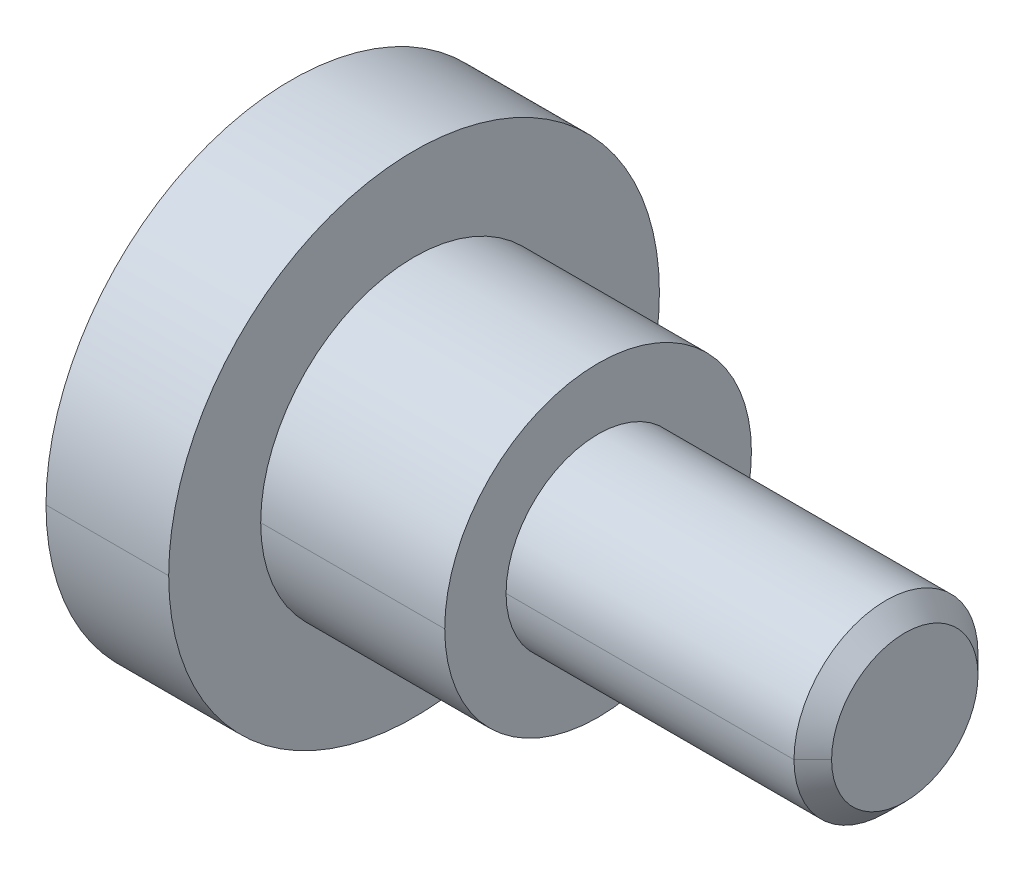
ISO-10303-21;
HEADER;
FILE_DESCRIPTION(('STEP AP214'),'2;1');
FILE_NAME('part.step','',(''),(''),'','','');
FILE_SCHEMA(('AUTOMOTIVE_DESIGN { 1 0 10303 214 1 1 1 1 }'));
ENDSEC;
DATA;
#1=APPLICATION_CONTEXT('core data for automotive mechanical design processes');
#2=APPLICATION_PROTOCOL_DEFINITION('international standard','automotive_design',2000,#1);
#3=PRODUCT_CONTEXT('',#1,'mechanical');
#4=PRODUCT('Part','Part','',(#3));
#5=PRODUCT_RELATED_PRODUCT_CATEGORY('part','',(#4));
#6=PRODUCT_DEFINITION_FORMATION('','',#4);
#7=PRODUCT_DEFINITION_CONTEXT('part definition',#1,'design');
#8=PRODUCT_DEFINITION('design','',#6,#7);
#9=PRODUCT_DEFINITION_SHAPE('','',#8);
#10=(LENGTH_UNIT() NAMED_UNIT(*) SI_UNIT(.MILLI.,.METRE.));
#11=(NAMED_UNIT(*) PLANE_ANGLE_UNIT() SI_UNIT($,.RADIAN.));
#12=(NAMED_UNIT(*) SI_UNIT($,.STERADIAN.) SOLID_ANGLE_UNIT());
#13=UNCERTAINTY_MEASURE_WITH_UNIT(LENGTH_MEASURE(1.E-05),#10,'distance_accuracy_value','');
#14=(GEOMETRIC_REPRESENTATION_CONTEXT(3) GLOBAL_UNCERTAINTY_ASSIGNED_CONTEXT((#13)) GLOBAL_UNIT_ASSIGNED_CONTEXT((#10,
#11,#12)) REPRESENTATION_CONTEXT('',''));
#15=CARTESIAN_POINT('',(0.,0.,0.));
#16=DIRECTION('',(0.,0.,1.));
#17=DIRECTION('',(1.,0.,0.));
#18=AXIS2_PLACEMENT_3D('',#15,#16,#17);
#19=CARTESIAN_POINT('',(-3.,0.,0.));
#20=DIRECTION('',(-1.,0.,0.));
#21=DIRECTION('',(0.,0.,1.));
#22=AXIS2_PLACEMENT_3D('',#19,#20,#21);
#23=PLANE('',#22);
#24=DIRECTION('',(0.,0.500000000000029,0.866025403784422));
#25=VECTOR('',#24,1.);
#26=CARTESIAN_POINT('',(-3.,-1.1547005383793,0.));
#27=LINE('',#26,#25);
#28=CARTESIAN_POINT('',(-3.,-1.1547005383793,0.));
#29=VERTEX_POINT('',#28);
#30=CARTESIAN_POINT('',(-3.,-0.866025403784422,0.500000000000029));
#31=VERTEX_POINT('',#30);
#32=EDGE_CURVE('E11',#29,#31,#27,.T.);
#33=ORIENTED_EDGE('',*,*,#32,.T.);
#34=CARTESIAN_POINT('',(-3.,0.,0.));
#35=DIRECTION('',(1.,0.,0.));
#36=DIRECTION('',(0.,0.,1.));
#37=AXIS2_PLACEMENT_3D('',#34,#35,#36);
#38=CIRCLE('',#37,1.);
#39=CARTESIAN_POINT('',(-3.,-0.866025403784422,-0.500000000000029));
#40=VERTEX_POINT('',#39);
#41=EDGE_CURVE('E24',#31,#40,#38,.T.);
#42=ORIENTED_EDGE('',*,*,#41,.T.);
#43=DIRECTION('',(0.,-0.500000000000029,0.866025403784422));
#44=VECTOR('',#43,1.);
#45=CARTESIAN_POINT('',(-3.,-0.57735026918963,-1.));
#46=LINE('',#45,#44);
#47=EDGE_CURVE('E377',#40,#29,#46,.T.);
#48=ORIENTED_EDGE('',*,*,#47,.T.);
#49=EDGE_LOOP('',(#33,#42,#48));
#50=FACE_BOUND('',#49,.T.);
#51=ADVANCED_FACE('F16',(#50),#23,.T.);
#52=CARTESIAN_POINT('',(-3.,-0.57735026918963,-1.));
#53=DIRECTION('',(0.,-0.866025403784422,-0.500000000000029));
#54=DIRECTION('',(0.,0.500000000000029,-0.866025403784422));
#55=AXIS2_PLACEMENT_3D('',#52,#53,#54);
#56=PLANE('',#55);
#57=DIRECTION('',(0.,-0.500000000000029,0.866025403784422));
#58=VECTOR('',#57,1.);
#59=CARTESIAN_POINT('',(-5.,-0.57735026918963,-1.));
#60=LINE('',#59,#58);
#61=CARTESIAN_POINT('',(-5.,-0.57735026918963,-1.));
#62=VERTEX_POINT('',#61);
#63=CARTESIAN_POINT('',(-5.,-1.1547005383793,0.));
#64=VERTEX_POINT('',#63);
#65=EDGE_CURVE('E373',#62,#64,#60,.T.);
#66=ORIENTED_EDGE('',*,*,#65,.T.);
#67=DIRECTION('',(-1.,0.,0.));
#68=VECTOR('',#67,1.);
#69=CARTESIAN_POINT('',(-3.,-1.1547005383793,0.));
#70=LINE('',#69,#68);
#71=EDGE_CURVE('E368',#29,#64,#70,.T.);
#72=ORIENTED_EDGE('',*,*,#71,.F.);
#73=ORIENTED_EDGE('',*,*,#47,.F.);
#74=DIRECTION('',(0.,-0.500000000000029,0.866025403784422));
#75=VECTOR('',#74,1.);
#76=CARTESIAN_POINT('',(-3.,-0.57735026918963,-1.));
#77=LINE('',#76,#75);
#78=CARTESIAN_POINT('',(-3.,-0.57735026918963,-1.));
#79=VERTEX_POINT('',#78);
#80=EDGE_CURVE('E363',#79,#40,#77,.T.);
#81=ORIENTED_EDGE('',*,*,#80,.F.);
#82=DIRECTION('',(-1.,0.,0.));
#83=VECTOR('',#82,1.);
#84=CARTESIAN_POINT('',(-3.,-0.57735026918963,-1.));
#85=LINE('',#84,#83);
#86=EDGE_CURVE('E359',#79,#62,#85,.T.);
#87=ORIENTED_EDGE('',*,*,#86,.T.);
#88=EDGE_LOOP('',(#66,#72,#73,#81,#87));
#89=FACE_BOUND('',#88,.T.);
#90=ADVANCED_FACE('F388',(#89),#56,.F.);
#91=CARTESIAN_POINT('',(-3.,0.57735026918963,-1.));
#92=DIRECTION('',(0.,0.,-1.));
#93=DIRECTION('',(-1.,0.,0.));
#94=AXIS2_PLACEMENT_3D('',#91,#92,#93);
#95=PLANE('',#94);
#96=DIRECTION('',(0.,-1.,0.));
#97=VECTOR('',#96,1.);
#98=CARTESIAN_POINT('',(-5.,0.57735026918963,-1.));
#99=LINE('',#98,#97);
#100=CARTESIAN_POINT('',(-5.,0.57735026918963,-1.));
#101=VERTEX_POINT('',#100);
#102=EDGE_CURVE('E354',#101,#62,#99,.T.);
#103=ORIENTED_EDGE('',*,*,#102,.T.);
#104=ORIENTED_EDGE('',*,*,#86,.F.);
#105=DIRECTION('',(0.,-1.,0.));
#106=VECTOR('',#105,1.);
#107=CARTESIAN_POINT('',(-3.,0.57735026918963,-1.));
#108=LINE('',#107,#106);
#109=CARTESIAN_POINT('',(-3.,0.,-1.));
#110=VERTEX_POINT('',#109);
#111=EDGE_CURVE('E349',#110,#79,#108,.T.);
#112=ORIENTED_EDGE('',*,*,#111,.F.);
#113=DIRECTION('',(0.,-1.,0.));
#114=VECTOR('',#113,1.);
#115=CARTESIAN_POINT('',(-3.,0.57735026918963,-1.));
#116=LINE('',#115,#114);
#117=CARTESIAN_POINT('',(-3.,0.57735026918963,-1.));
#118=VERTEX_POINT('',#117);
#119=EDGE_CURVE('E344',#118,#110,#116,.T.);
#120=ORIENTED_EDGE('',*,*,#119,.F.);
#121=DIRECTION('',(-1.,0.,0.));
#122=VECTOR('',#121,1.);
#123=CARTESIAN_POINT('',(-3.,0.57735026918963,-1.));
#124=LINE('',#123,#122);
#125=EDGE_CURVE('E340',#118,#101,#124,.T.);
#126=ORIENTED_EDGE('',*,*,#125,.T.);
#127=EDGE_LOOP('',(#103,#104,#112,#120,#126));
#128=FACE_BOUND('',#127,.T.);
#129=ADVANCED_FACE('F406',(#128),#95,.F.);
#130=CARTESIAN_POINT('',(-3.,1.1547005383793,0.));
#131=DIRECTION('',(0.,0.866025403784422,-0.500000000000029));
#132=DIRECTION('',(0.,0.500000000000029,0.866025403784422));
#133=AXIS2_PLACEMENT_3D('',#130,#131,#132);
#134=PLANE('',#133);
#135=DIRECTION('',(0.,-0.500000000000029,-0.866025403784422));
#136=VECTOR('',#135,1.);
#137=CARTESIAN_POINT('',(-5.,1.1547005383793,0.));
#138=LINE('',#137,#136);
#139=CARTESIAN_POINT('',(-5.,1.1547005383793,0.));
#140=VERTEX_POINT('',#139);
#141=EDGE_CURVE('E335',#140,#101,#138,.T.);
#142=ORIENTED_EDGE('',*,*,#141,.T.);
#143=ORIENTED_EDGE('',*,*,#125,.F.);
#144=DIRECTION('',(0.,-0.500000000000029,-0.866025403784422));
#145=VECTOR('',#144,1.);
#146=CARTESIAN_POINT('',(-3.,1.1547005383793,0.));
#147=LINE('',#146,#145);
#148=CARTESIAN_POINT('',(-3.,0.866025403784422,-0.500000000000029));
#149=VERTEX_POINT('',#148);
#150=EDGE_CURVE('E330',#149,#118,#147,.T.);
#151=ORIENTED_EDGE('',*,*,#150,.F.);
#152=DIRECTION('',(0.,-0.500000000000029,-0.866025403784422));
#153=VECTOR('',#152,1.);
#154=CARTESIAN_POINT('',(-3.,1.1547005383793,0.));
#155=LINE('',#154,#153);
#156=CARTESIAN_POINT('',(-3.,1.1547005383793,0.));
#157=VERTEX_POINT('',#156);
#158=EDGE_CURVE('E325',#157,#149,#155,.T.);
#159=ORIENTED_EDGE('',*,*,#158,.F.);
#160=DIRECTION('',(-1.,0.,0.));
#161=VECTOR('',#160,1.);
#162=CARTESIAN_POINT('',(-3.,1.1547005383793,0.));
#163=LINE('',#162,#161);
#164=EDGE_CURVE('E321',#157,#140,#163,.T.);
#165=ORIENTED_EDGE('',*,*,#164,.T.);
#166=EDGE_LOOP('',(#142,#143,#151,#159,#165));
#167=FACE_BOUND('',#166,.T.);
#168=ADVANCED_FACE('F429',(#167),#134,.F.);
#169=CARTESIAN_POINT('',(-3.,0.57735026918963,1.));
#170=DIRECTION('',(0.,0.866025403784422,0.500000000000029));
#171=DIRECTION('',(0.,-0.500000000000029,0.866025403784422));
#172=AXIS2_PLACEMENT_3D('',#169,#170,#171);
#173=PLANE('',#172);
#174=DIRECTION('',(0.,0.500000000000029,-0.866025403784422));
#175=VECTOR('',#174,1.);
#176=CARTESIAN_POINT('',(-5.,0.57735026918963,1.));
#177=LINE('',#176,#175);
#178=CARTESIAN_POINT('',(-5.,0.57735026918963,1.));
#179=VERTEX_POINT('',#178);
#180=EDGE_CURVE('E316',#179,#140,#177,.T.);
#181=ORIENTED_EDGE('',*,*,#180,.T.);
#182=ORIENTED_EDGE('',*,*,#164,.F.);
#183=DIRECTION('',(0.,0.500000000000029,-0.866025403784422));
#184=VECTOR('',#183,1.);
#185=CARTESIAN_POINT('',(-3.,0.57735026918963,1.));
#186=LINE('',#185,#184);
#187=CARTESIAN_POINT('',(-3.,0.866025403784422,0.500000000000029));
#188=VERTEX_POINT('',#187);
#189=EDGE_CURVE('E311',#188,#157,#186,.T.);
#190=ORIENTED_EDGE('',*,*,#189,.F.);
#191=DIRECTION('',(0.,0.500000000000029,-0.866025403784422));
#192=VECTOR('',#191,1.);
#193=CARTESIAN_POINT('',(-3.,0.57735026918963,1.));
#194=LINE('',#193,#192);
#195=CARTESIAN_POINT('',(-3.,0.57735026918963,1.));
#196=VERTEX_POINT('',#195);
#197=EDGE_CURVE('E306',#196,#188,#194,.T.);
#198=ORIENTED_EDGE('',*,*,#197,.F.);
#199=DIRECTION('',(-1.,0.,0.));
#200=VECTOR('',#199,1.);
#201=CARTESIAN_POINT('',(-3.,0.57735026918963,1.));
#202=LINE('',#201,#200);
#203=EDGE_CURVE('E302',#196,#179,#202,.T.);
#204=ORIENTED_EDGE('',*,*,#203,.T.);
#205=EDGE_LOOP('',(#181,#182,#190,#198,#204));
#206=FACE_BOUND('',#205,.T.);
#207=ADVANCED_FACE('F431',(#206),#173,.F.);
#208=CARTESIAN_POINT('',(-3.,-0.57735026918963,1.));
#209=DIRECTION('',(0.,0.,1.));
#210=DIRECTION('',(1.,0.,0.));
#211=AXIS2_PLACEMENT_3D('',#208,#209,#210);
#212=PLANE('',#211);
#213=DIRECTION('',(0.,1.,0.));
#214=VECTOR('',#213,1.);
#215=CARTESIAN_POINT('',(-5.,-0.57735026918963,1.));
#216=LINE('',#215,#214);
#217=CARTESIAN_POINT('',(-5.,-0.57735026918963,1.));
#218=VERTEX_POINT('',#217);
#219=EDGE_CURVE('E297',#218,#179,#216,.T.);
#220=ORIENTED_EDGE('',*,*,#219,.T.);
#221=ORIENTED_EDGE('',*,*,#203,.F.);
#222=DIRECTION('',(0.,1.,0.));
#223=VECTOR('',#222,1.);
#224=CARTESIAN_POINT('',(-3.,-0.57735026918963,1.));
#225=LINE('',#224,#223);
#226=CARTESIAN_POINT('',(-3.,0.,1.));
#227=VERTEX_POINT('',#226);
#228=EDGE_CURVE('E292',#227,#196,#225,.T.);
#229=ORIENTED_EDGE('',*,*,#228,.F.);
#230=DIRECTION('',(0.,1.,0.));
#231=VECTOR('',#230,1.);
#232=CARTESIAN_POINT('',(-3.,-0.57735026918963,1.));
#233=LINE('',#232,#231);
#234=CARTESIAN_POINT('',(-3.,-0.57735026918963,1.));
#235=VERTEX_POINT('',#234);
#236=EDGE_CURVE('E287',#235,#227,#233,.T.);
#237=ORIENTED_EDGE('',*,*,#236,.F.);
#238=DIRECTION('',(-1.,0.,0.));
#239=VECTOR('',#238,1.);
#240=CARTESIAN_POINT('',(-3.,-0.57735026918963,1.));
#241=LINE('',#240,#239);
#242=EDGE_CURVE('E283',#235,#218,#241,.T.);
#243=ORIENTED_EDGE('',*,*,#242,.T.);
#244=EDGE_LOOP('',(#220,#221,#229,#237,#243));
#245=FACE_BOUND('',#244,.T.);
#246=ADVANCED_FACE('F415',(#245),#212,.F.);
#247=CARTESIAN_POINT('',(-3.,-1.1547005383793,0.));
#248=DIRECTION('',(0.,-0.866025403784422,0.500000000000029));
#249=DIRECTION('',(0.,-0.500000000000029,-0.866025403784422));
#250=AXIS2_PLACEMENT_3D('',#247,#248,#249);
#251=PLANE('',#250);
#252=DIRECTION('',(0.,0.500000000000029,0.866025403784422));
#253=VECTOR('',#252,1.);
#254=CARTESIAN_POINT('',(-5.,-1.1547005383793,0.));
#255=LINE('',#254,#253);
#256=EDGE_CURVE('E278',#64,#218,#255,.T.);
#257=ORIENTED_EDGE('',*,*,#256,.T.);
#258=ORIENTED_EDGE('',*,*,#242,.F.);
#259=DIRECTION('',(0.,0.500000000000029,0.866025403784422));
#260=VECTOR('',#259,1.);
#261=CARTESIAN_POINT('',(-3.,-1.1547005383793,0.));
#262=LINE('',#261,#260);
#263=EDGE_CURVE('E273',#31,#235,#262,.T.);
#264=ORIENTED_EDGE('',*,*,#263,.F.);
#265=ORIENTED_EDGE('',*,*,#32,.F.);
#266=ORIENTED_EDGE('',*,*,#71,.T.);
#267=EDGE_LOOP('',(#257,#258,#264,#265,#266));
#268=FACE_BOUND('',#267,.T.);
#269=ADVANCED_FACE('F393',(#268),#251,.F.);
#270=CARTESIAN_POINT('',(-3.,0.,0.));
#271=DIRECTION('',(-1.,0.,0.));
#272=DIRECTION('',(0.,0.,1.));
#273=AXIS2_PLACEMENT_3D('',#270,#271,#272);
#274=PLANE('',#273);
#275=ORIENTED_EDGE('',*,*,#236,.T.);
#276=CARTESIAN_POINT('',(-3.,0.,0.));
#277=DIRECTION('',(1.,0.,0.));
#278=DIRECTION('',(0.,0.,1.));
#279=AXIS2_PLACEMENT_3D('',#276,#277,#278);
#280=CIRCLE('',#279,1.);
#281=EDGE_CURVE('E268',#227,#31,#280,.T.);
#282=ORIENTED_EDGE('',*,*,#281,.T.);
#283=ORIENTED_EDGE('',*,*,#263,.T.);
#284=EDGE_LOOP('',(#275,#282,#283));
#285=FACE_BOUND('',#284,.T.);
#286=ADVANCED_FACE('F397',(#285),#274,.T.);
#287=CARTESIAN_POINT('',(-3.,0.,0.));
#288=DIRECTION('',(-1.,0.,0.));
#289=DIRECTION('',(0.,1.,0.));
#290=AXIS2_PLACEMENT_3D('',#287,#288,#289);
#291=CONICAL_SURFACE('',#290,1.,1.04719755119662);
#292=DIRECTION('',(-0.499999999999983,0.,-0.866025403784448));
#293=VECTOR('',#292,1.);
#294=CARTESIAN_POINT('',(-2.4226497308104,0.,0.));
#295=LINE('',#294,#293);
#296=CARTESIAN_POINT('',(-2.4226497308104,0.,0.));
#297=VERTEX_POINT('',#296);
#298=EDGE_CURVE('E263',#297,#110,#295,.T.);
#299=ORIENTED_EDGE('',*,*,#298,.T.);
#300=CARTESIAN_POINT('',(-3.,0.,0.));
#301=DIRECTION('',(1.,0.,0.));
#302=DIRECTION('',(0.,0.,1.));
#303=AXIS2_PLACEMENT_3D('',#300,#301,#302);
#304=CIRCLE('',#303,1.);
#305=EDGE_CURVE('E258',#40,#110,#304,.T.);
#306=ORIENTED_EDGE('',*,*,#305,.F.);
#307=ORIENTED_EDGE('',*,*,#41,.F.);
#308=ORIENTED_EDGE('',*,*,#281,.F.);
#309=DIRECTION('',(-0.499999999999983,0.,0.866025403784448));
#310=VECTOR('',#309,1.);
#311=CARTESIAN_POINT('',(-2.4226497308104,0.,0.));
#312=LINE('',#311,#310);
#313=EDGE_CURVE('E253',#297,#227,#312,.T.);
#314=ORIENTED_EDGE('',*,*,#313,.F.);
#315=EDGE_LOOP('',(#299,#306,#307,#308,#314));
#316=FACE_BOUND('',#315,.T.);
#317=ADVANCED_FACE('F399',(#316),#291,.F.);
#318=CARTESIAN_POINT('',(-3.,0.,0.));
#319=DIRECTION('',(-1.,0.,0.));
#320=DIRECTION('',(0.,-1.,0.));
#321=AXIS2_PLACEMENT_3D('',#318,#319,#320);
#322=CONICAL_SURFACE('',#321,1.,1.04719755119662);
#323=ORIENTED_EDGE('',*,*,#313,.T.);
#324=CARTESIAN_POINT('',(-3.,0.,0.));
#325=DIRECTION('',(1.,0.,0.));
#326=DIRECTION('',(0.,0.,1.));
#327=AXIS2_PLACEMENT_3D('',#324,#325,#326);
#328=CIRCLE('',#327,1.);
#329=EDGE_CURVE('E248',#188,#227,#328,.T.);
#330=ORIENTED_EDGE('',*,*,#329,.F.);
#331=CARTESIAN_POINT('',(-3.,0.,0.));
#332=DIRECTION('',(1.,0.,0.));
#333=DIRECTION('',(0.,0.,1.));
#334=AXIS2_PLACEMENT_3D('',#331,#332,#333);
#335=CIRCLE('',#334,1.);
#336=EDGE_CURVE('E243',#149,#188,#335,.T.);
#337=ORIENTED_EDGE('',*,*,#336,.F.);
#338=CARTESIAN_POINT('',(-3.,0.,0.));
#339=DIRECTION('',(1.,0.,0.));
#340=DIRECTION('',(0.,0.,1.));
#341=AXIS2_PLACEMENT_3D('',#338,#339,#340);
#342=CIRCLE('',#341,1.);
#343=EDGE_CURVE('E238',#110,#149,#342,.T.);
#344=ORIENTED_EDGE('',*,*,#343,.F.);
#345=ORIENTED_EDGE('',*,*,#298,.F.);
#346=EDGE_LOOP('',(#323,#330,#337,#344,#345));
#347=FACE_BOUND('',#346,.T.);
#348=ADVANCED_FACE('F421',(#347),#322,.F.);
#349=CARTESIAN_POINT('',(-3.,0.,0.));
#350=DIRECTION('',(-1.,0.,0.));
#351=DIRECTION('',(0.,0.,1.));
#352=AXIS2_PLACEMENT_3D('',#349,#350,#351);
#353=PLANE('',#352);
#354=ORIENTED_EDGE('',*,*,#119,.T.);
#355=ORIENTED_EDGE('',*,*,#343,.T.);
#356=ORIENTED_EDGE('',*,*,#150,.T.);
#357=EDGE_LOOP('',(#354,#355,#356));
#358=FACE_BOUND('',#357,.T.);
#359=ADVANCED_FACE('F424',(#358),#353,.T.);
#360=CARTESIAN_POINT('',(-3.,0.,0.));
#361=DIRECTION('',(-1.,0.,0.));
#362=DIRECTION('',(0.,0.,1.));
#363=AXIS2_PLACEMENT_3D('',#360,#361,#362);
#364=PLANE('',#363);
#365=ORIENTED_EDGE('',*,*,#158,.T.);
#366=ORIENTED_EDGE('',*,*,#336,.T.);
#367=ORIENTED_EDGE('',*,*,#189,.T.);
#368=EDGE_LOOP('',(#365,#366,#367));
#369=FACE_BOUND('',#368,.T.);
#370=ADVANCED_FACE('F426',(#369),#364,.T.);
#371=CARTESIAN_POINT('',(-3.,0.,0.));
#372=DIRECTION('',(-1.,0.,0.));
#373=DIRECTION('',(0.,0.,1.));
#374=AXIS2_PLACEMENT_3D('',#371,#372,#373);
#375=PLANE('',#374);
#376=ORIENTED_EDGE('',*,*,#197,.T.);
#377=ORIENTED_EDGE('',*,*,#329,.T.);
#378=ORIENTED_EDGE('',*,*,#228,.T.);
#379=EDGE_LOOP('',(#376,#377,#378));
#380=FACE_BOUND('',#379,.T.);
#381=ADVANCED_FACE('F418',(#380),#375,.T.);
#382=CARTESIAN_POINT('',(-3.,0.,0.));
#383=DIRECTION('',(-1.,0.,0.));
#384=DIRECTION('',(0.,0.,1.));
#385=AXIS2_PLACEMENT_3D('',#382,#383,#384);
#386=PLANE('',#385);
#387=ORIENTED_EDGE('',*,*,#80,.T.);
#388=ORIENTED_EDGE('',*,*,#305,.T.);
#389=ORIENTED_EDGE('',*,*,#111,.T.);
#390=EDGE_LOOP('',(#387,#388,#389));
#391=FACE_BOUND('',#390,.T.);
#392=ADVANCED_FACE('F402',(#391),#386,.T.);
#393=CARTESIAN_POINT('',(-5.,0.,0.));
#394=DIRECTION('',(1.,0.,0.));
#395=DIRECTION('',(0.,0.,-1.));
#396=AXIS2_PLACEMENT_3D('',#393,#394,#395);
#397=PLANE('',#396);
#398=CARTESIAN_POINT('',(-5.,0.,0.));
#399=DIRECTION('',(1.,0.,0.));
#400=DIRECTION('',(0.,0.,-1.));
#401=AXIS2_PLACEMENT_3D('',#398,#399,#400);
#402=CIRCLE('',#401,4.);
#403=CARTESIAN_POINT('',(-5.,0.,4.));
#404=VERTEX_POINT('',#403);
#405=CARTESIAN_POINT('',(-5.,0.,-4.));
#406=VERTEX_POINT('',#405);
#407=EDGE_CURVE('E233',#404,#406,#402,.T.);
#408=ORIENTED_EDGE('',*,*,#407,.F.);
#409=CARTESIAN_POINT('',(-5.,0.,0.));
#410=DIRECTION('',(1.,0.,0.));
#411=DIRECTION('',(0.,0.,-1.));
#412=AXIS2_PLACEMENT_3D('',#409,#410,#411);
#413=CIRCLE('',#412,4.);
#414=EDGE_CURVE('E228',#406,#404,#413,.T.);
#415=ORIENTED_EDGE('',*,*,#414,.F.);
#416=EDGE_LOOP('',(#408,#415));
#417=FACE_BOUND('',#416,.T.);
#418=ORIENTED_EDGE('',*,*,#256,.F.);
#419=ORIENTED_EDGE('',*,*,#65,.F.);
#420=ORIENTED_EDGE('',*,*,#102,.F.);
#421=ORIENTED_EDGE('',*,*,#141,.F.);
#422=ORIENTED_EDGE('',*,*,#180,.F.);
#423=ORIENTED_EDGE('',*,*,#219,.F.);
#424=EDGE_LOOP('',(#418,#419,#420,#421,#422,#423));
#425=FACE_BOUND('',#424,.T.);
#426=ADVANCED_FACE('F410',(#417,#425),#397,.F.);
#427=CARTESIAN_POINT('',(5.,0.,0.));
#428=DIRECTION('',(1.,0.,0.));
#429=DIRECTION('',(0.,-1.,0.));
#430=AXIS2_PLACEMENT_3D('',#427,#428,#429);
#431=CYLINDRICAL_SURFACE('',#430,4.);
#432=DIRECTION('',(1.,0.,0.));
#433=VECTOR('',#432,1.);
#434=CARTESIAN_POINT('',(-5.,0.,4.));
#435=LINE('',#434,#433);
#436=CARTESIAN_POINT('',(-3.,0.,4.));
#437=VERTEX_POINT('',#436);
#438=EDGE_CURVE('E224',#404,#437,#435,.T.);
#439=ORIENTED_EDGE('',*,*,#438,.T.);
#440=CARTESIAN_POINT('',(-3.,0.,0.));
#441=DIRECTION('',(1.,0.,0.));
#442=DIRECTION('',(0.,0.,-1.));
#443=AXIS2_PLACEMENT_3D('',#440,#441,#442);
#444=CIRCLE('',#443,4.);
#445=CARTESIAN_POINT('',(-3.,0.,-4.));
#446=VERTEX_POINT('',#445);
#447=EDGE_CURVE('E219',#446,#437,#444,.T.);
#448=ORIENTED_EDGE('',*,*,#447,.F.);
#449=DIRECTION('',(1.,0.,0.));
#450=VECTOR('',#449,1.);
#451=CARTESIAN_POINT('',(-5.,0.,-4.));
#452=LINE('',#451,#450);
#453=EDGE_CURVE('E214',#406,#446,#452,.T.);
#454=ORIENTED_EDGE('',*,*,#453,.F.);
#455=ORIENTED_EDGE('',*,*,#414,.T.);
#456=EDGE_LOOP('',(#439,#448,#454,#455));
#457=FACE_BOUND('',#456,.T.);
#458=ADVANCED_FACE('F543',(#457),#431,.T.);
#459=CARTESIAN_POINT('',(5.,0.,0.));
#460=DIRECTION('',(1.,0.,0.));
#461=DIRECTION('',(0.,1.,0.));
#462=AXIS2_PLACEMENT_3D('',#459,#460,#461);
#463=CYLINDRICAL_SURFACE('',#462,4.);
#464=ORIENTED_EDGE('',*,*,#438,.F.);
#465=ORIENTED_EDGE('',*,*,#407,.T.);
#466=ORIENTED_EDGE('',*,*,#453,.T.);
#467=CARTESIAN_POINT('',(-3.,0.,0.));
#468=DIRECTION('',(1.,0.,0.));
#469=DIRECTION('',(0.,0.,-1.));
#470=AXIS2_PLACEMENT_3D('',#467,#468,#469);
#471=CIRCLE('',#470,4.);
#472=EDGE_CURVE('E209',#437,#446,#471,.T.);
#473=ORIENTED_EDGE('',*,*,#472,.F.);
#474=EDGE_LOOP('',(#464,#465,#466,#473));
#475=FACE_BOUND('',#474,.T.);
#476=ADVANCED_FACE('F553',(#475),#463,.T.);
#477=CARTESIAN_POINT('',(-3.,4.,0.));
#478=DIRECTION('',(-1.,0.,0.));
#479=DIRECTION('',(0.,0.,1.));
#480=AXIS2_PLACEMENT_3D('',#477,#478,#479);
#481=PLANE('',#480);
#482=CARTESIAN_POINT('',(-3.,0.,0.));
#483=DIRECTION('',(1.,0.,0.));
#484=DIRECTION('',(0.,0.,-1.));
#485=AXIS2_PLACEMENT_3D('',#482,#483,#484);
#486=CIRCLE('',#485,2.5);
#487=CARTESIAN_POINT('',(-3.,0.,2.5));
#488=VERTEX_POINT('',#487);
#489=CARTESIAN_POINT('',(-3.,0.,-2.5));
#490=VERTEX_POINT('',#489);
#491=EDGE_CURVE('E204',#488,#490,#486,.T.);
#492=ORIENTED_EDGE('',*,*,#491,.F.);
#493=CARTESIAN_POINT('',(-3.,0.,0.));
#494=DIRECTION('',(1.,0.,0.));
#495=DIRECTION('',(0.,0.,-1.));
#496=AXIS2_PLACEMENT_3D('',#493,#494,#495);
#497=CIRCLE('',#496,2.5);
#498=EDGE_CURVE('E199',#490,#488,#497,.T.);
#499=ORIENTED_EDGE('',*,*,#498,.F.);
#500=EDGE_LOOP('',(#492,#499));
#501=FACE_BOUND('',#500,.T.);
#502=ORIENTED_EDGE('',*,*,#447,.T.);
#503=ORIENTED_EDGE('',*,*,#472,.T.);
#504=EDGE_LOOP('',(#502,#503));
#505=FACE_BOUND('',#504,.T.);
#506=ADVANCED_FACE('F563',(#501,#505),#481,.F.);
#507=CARTESIAN_POINT('',(5.,0.,0.));
#508=DIRECTION('',(1.,0.,0.));
#509=DIRECTION('',(0.,-1.,0.));
#510=AXIS2_PLACEMENT_3D('',#507,#508,#509);
#511=CYLINDRICAL_SURFACE('',#510,2.5);
#512=DIRECTION('',(1.,0.,0.));
#513=VECTOR('',#512,1.);
#514=CARTESIAN_POINT('',(-3.,0.,2.5));
#515=LINE('',#514,#513);
#516=CARTESIAN_POINT('',(0.,0.,2.5));
#517=VERTEX_POINT('',#516);
#518=EDGE_CURVE('E195',#488,#517,#515,.T.);
#519=ORIENTED_EDGE('',*,*,#518,.T.);
#520=CARTESIAN_POINT('',(0.,0.,0.));
#521=DIRECTION('',(1.,0.,0.));
#522=DIRECTION('',(0.,0.,-1.));
#523=AXIS2_PLACEMENT_3D('',#520,#521,#522);
#524=CIRCLE('',#523,2.5);
#525=CARTESIAN_POINT('',(0.,0.,-2.5));
#526=VERTEX_POINT('',#525);
#527=EDGE_CURVE('E190',#526,#517,#524,.T.);
#528=ORIENTED_EDGE('',*,*,#527,.F.);
#529=DIRECTION('',(1.,0.,0.));
#530=VECTOR('',#529,1.);
#531=CARTESIAN_POINT('',(-3.,0.,-2.5));
#532=LINE('',#531,#530);
#533=EDGE_CURVE('E185',#490,#526,#532,.T.);
#534=ORIENTED_EDGE('',*,*,#533,.F.);
#535=ORIENTED_EDGE('',*,*,#498,.T.);
#536=EDGE_LOOP('',(#519,#528,#534,#535));
#537=FACE_BOUND('',#536,.T.);
#538=ADVANCED_FACE('F573',(#537),#511,.T.);
#539=CARTESIAN_POINT('',(5.,0.,0.));
#540=DIRECTION('',(1.,0.,0.));
#541=DIRECTION('',(0.,1.,0.));
#542=AXIS2_PLACEMENT_3D('',#539,#540,#541);
#543=CYLINDRICAL_SURFACE('',#542,2.5);
#544=ORIENTED_EDGE('',*,*,#518,.F.);
#545=ORIENTED_EDGE('',*,*,#491,.T.);
#546=ORIENTED_EDGE('',*,*,#533,.T.);
#547=CARTESIAN_POINT('',(0.,0.,0.));
#548=DIRECTION('',(1.,0.,0.));
#549=DIRECTION('',(0.,0.,-1.));
#550=AXIS2_PLACEMENT_3D('',#547,#548,#549);
#551=CIRCLE('',#550,2.5);
#552=EDGE_CURVE('E180',#517,#526,#551,.T.);
#553=ORIENTED_EDGE('',*,*,#552,.F.);
#554=EDGE_LOOP('',(#544,#545,#546,#553));
#555=FACE_BOUND('',#554,.T.);
#556=ADVANCED_FACE('F583',(#555),#543,.T.);
#557=CARTESIAN_POINT('',(0.,2.5,0.));
#558=DIRECTION('',(-1.,0.,0.));
#559=DIRECTION('',(0.,0.,1.));
#560=AXIS2_PLACEMENT_3D('',#557,#558,#559);
#561=PLANE('',#560);
#562=CARTESIAN_POINT('',(0.,0.,0.));
#563=DIRECTION('',(1.,0.,0.));
#564=DIRECTION('',(0.,0.,-1.));
#565=AXIS2_PLACEMENT_3D('',#562,#563,#564);
#566=CIRCLE('',#565,1.5);
#567=CARTESIAN_POINT('',(0.,0.,1.5));
#568=VERTEX_POINT('',#567);
#569=CARTESIAN_POINT('',(0.,0.,-1.5));
#570=VERTEX_POINT('',#569);
#571=EDGE_CURVE('E175',#568,#570,#566,.T.);
#572=ORIENTED_EDGE('',*,*,#571,.F.);
#573=CARTESIAN_POINT('',(0.,0.,0.));
#574=DIRECTION('',(1.,0.,0.));
#575=DIRECTION('',(0.,0.,-1.));
#576=AXIS2_PLACEMENT_3D('',#573,#574,#575);
#577=CIRCLE('',#576,1.5);
#578=EDGE_CURVE('E170',#570,#568,#577,.T.);
#579=ORIENTED_EDGE('',*,*,#578,.F.);
#580=EDGE_LOOP('',(#572,#579));
#581=FACE_BOUND('',#580,.T.);
#582=ORIENTED_EDGE('',*,*,#527,.T.);
#583=ORIENTED_EDGE('',*,*,#552,.T.);
#584=EDGE_LOOP('',(#582,#583));
#585=FACE_BOUND('',#584,.T.);
#586=ADVANCED_FACE('F593',(#581,#585),#561,.F.);
#587=CARTESIAN_POINT('',(5.,0.,0.));
#588=DIRECTION('',(1.,0.,0.));
#589=DIRECTION('',(0.,-1.,0.));
#590=AXIS2_PLACEMENT_3D('',#587,#588,#589);
#591=CYLINDRICAL_SURFACE('',#590,1.5);
#592=DIRECTION('',(1.,0.,0.));
#593=VECTOR('',#592,1.);
#594=CARTESIAN_POINT('',(0.,0.,1.5));
#595=LINE('',#594,#593);
#596=CARTESIAN_POINT('',(4.6935,0.,1.5));
#597=VERTEX_POINT('',#596);
#598=EDGE_CURVE('E166',#568,#597,#595,.T.);
#599=ORIENTED_EDGE('',*,*,#598,.T.);
#600=CARTESIAN_POINT('',(4.6935,0.,0.));
#601=DIRECTION('',(1.,0.,0.));
#602=DIRECTION('',(0.,0.,-1.));
#603=AXIS2_PLACEMENT_3D('',#600,#601,#602);
#604=CIRCLE('',#603,1.5);
#605=CARTESIAN_POINT('',(4.6935,0.,-1.5));
#606=VERTEX_POINT('',#605);
#607=EDGE_CURVE('E144',#606,#597,#604,.T.);
#608=ORIENTED_EDGE('',*,*,#607,.F.);
#609=DIRECTION('',(1.,0.,0.));
#610=VECTOR('',#609,1.);
#611=CARTESIAN_POINT('',(0.,0.,-1.5));
#612=LINE('',#611,#610);
#613=EDGE_CURVE('E158',#570,#606,#612,.T.);
#614=ORIENTED_EDGE('',*,*,#613,.F.);
#615=ORIENTED_EDGE('',*,*,#578,.T.);
#616=EDGE_LOOP('',(#599,#608,#614,#615));
#617=FACE_BOUND('',#616,.T.);
#618=ADVANCED_FACE('F603',(#617),#591,.T.);
#619=CARTESIAN_POINT('',(5.,0.,0.));
#620=DIRECTION('',(1.,0.,0.));
#621=DIRECTION('',(0.,1.,0.));
#622=AXIS2_PLACEMENT_3D('',#619,#620,#621);
#623=CYLINDRICAL_SURFACE('',#622,1.5);
#624=ORIENTED_EDGE('',*,*,#598,.F.);
#625=ORIENTED_EDGE('',*,*,#571,.T.);
#626=ORIENTED_EDGE('',*,*,#613,.T.);
#627=CARTESIAN_POINT('',(4.6935,0.,0.));
#628=DIRECTION('',(1.,0.,0.));
#629=DIRECTION('',(0.,0.,-1.));
#630=AXIS2_PLACEMENT_3D('',#627,#628,#629);
#631=CIRCLE('',#630,1.5);
#632=EDGE_CURVE('E154',#597,#606,#631,.T.);
#633=ORIENTED_EDGE('',*,*,#632,.F.);
#634=EDGE_LOOP('',(#624,#625,#626,#633));
#635=FACE_BOUND('',#634,.T.);
#636=ADVANCED_FACE('F613',(#635),#623,.T.);
#637=CARTESIAN_POINT('',(4.6935,0.,0.));
#638=DIRECTION('',(-1.,0.,0.));
#639=DIRECTION('',(0.,1.,0.));
#640=AXIS2_PLACEMENT_3D('',#637,#638,#639);
#641=CONICAL_SURFACE('',#640,1.5,0.785398163397448);
#642=DIRECTION('',(-0.707106781186548,0.,-0.707106781186547));
#643=VECTOR('',#642,1.);
#644=CARTESIAN_POINT('',(5.,0.,-1.1935));
#645=LINE('',#644,#643);
#646=CARTESIAN_POINT('',(5.,0.,-1.1935));
#647=VERTEX_POINT('',#646);
#648=EDGE_CURVE('E135',#647,#606,#645,.T.);
#649=ORIENTED_EDGE('',*,*,#648,.F.);
#650=CARTESIAN_POINT('',(5.,0.,0.));
#651=DIRECTION('',(1.,0.,0.));
#652=DIRECTION('',(0.,0.,-1.));
#653=AXIS2_PLACEMENT_3D('',#650,#651,#652);
#654=CIRCLE('',#653,1.1935);
#655=CARTESIAN_POINT('',(5.,0.,1.1935));
#656=VERTEX_POINT('',#655);
#657=EDGE_CURVE('E127',#656,#647,#654,.T.);
#658=ORIENTED_EDGE('',*,*,#657,.F.);
#659=DIRECTION('',(-0.707106781186548,0.,0.707106781186547));
#660=VECTOR('',#659,1.);
#661=CARTESIAN_POINT('',(5.,0.,1.1935));
#662=LINE('',#661,#660);
#663=EDGE_CURVE('E132',#656,#597,#662,.T.);
#664=ORIENTED_EDGE('',*,*,#663,.T.);
#665=ORIENTED_EDGE('',*,*,#632,.T.);
#666=EDGE_LOOP('',(#649,#658,#664,#665));
#667=FACE_BOUND('',#666,.T.);
#668=ADVANCED_FACE('F129',(#667),#641,.T.);
#669=CARTESIAN_POINT('',(4.6935,0.,0.));
#670=DIRECTION('',(-1.,0.,0.));
#671=DIRECTION('',(0.,-1.,0.));
#672=AXIS2_PLACEMENT_3D('',#669,#670,#671);
#673=CONICAL_SURFACE('',#672,1.5,0.785398163397448);
#674=ORIENTED_EDGE('',*,*,#648,.T.);
#675=ORIENTED_EDGE('',*,*,#607,.T.);
#676=ORIENTED_EDGE('',*,*,#663,.F.);
#677=CARTESIAN_POINT('',(5.,0.,0.));
#678=DIRECTION('',(1.,0.,0.));
#679=DIRECTION('',(0.,0.,-1.));
#680=AXIS2_PLACEMENT_3D('',#677,#678,#679);
#681=CIRCLE('',#680,1.1935);
#682=EDGE_CURVE('E139',#647,#656,#681,.T.);
#683=ORIENTED_EDGE('',*,*,#682,.F.);
#684=EDGE_LOOP('',(#674,#675,#676,#683));
#685=FACE_BOUND('',#684,.T.);
#686=ADVANCED_FACE('F143',(#685),#673,.T.);
#687=CARTESIAN_POINT('',(5.,1.1935,0.));
#688=DIRECTION('',(-1.,0.,0.));
#689=DIRECTION('',(0.,0.,1.));
#690=AXIS2_PLACEMENT_3D('',#687,#688,#689);
#691=PLANE('',#690);
#692=ORIENTED_EDGE('',*,*,#682,.T.);
#693=ORIENTED_EDGE('',*,*,#657,.T.);
#694=EDGE_LOOP('',(#692,#693));
#695=FACE_BOUND('',#694,.T.);
#696=ADVANCED_FACE('F140',(#695),#691,.F.);
#697=CLOSED_SHELL('',(#51,#90,#129,#168,#207,#246,#269,#286,#317,#348,#359,#370,#381,#392,#426,
#458,#476,#506,#538,#556,#586,#618,#636,#668,#686,#696));
#698=MANIFOLD_SOLID_BREP('B1',#697);
#699=ADVANCED_BREP_SHAPE_REPRESENTATION('',(#18,#698),#14);
#700=SHAPE_DEFINITION_REPRESENTATION(#9,#699);
ENDSEC;
END-ISO-10303-21;
